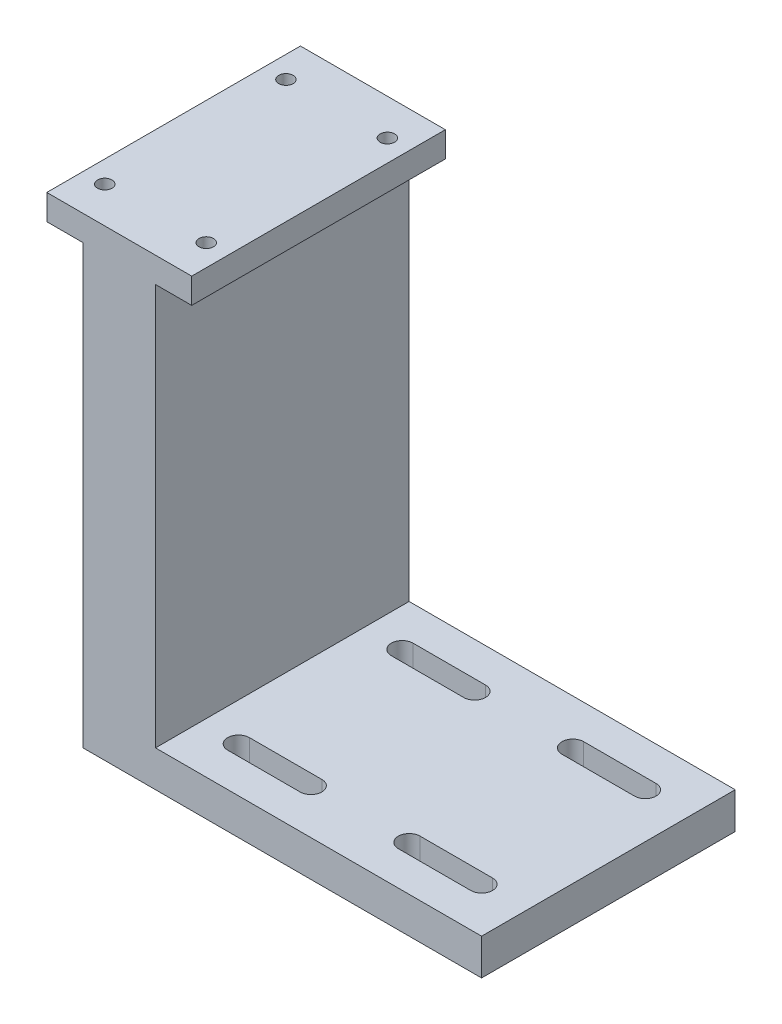
ISO-10303-21;
HEADER;
FILE_DESCRIPTION(('STEP AP214'),'2;1');
FILE_NAME('part.step','',(''),(''),'','','');
FILE_SCHEMA(('AUTOMOTIVE_DESIGN { 1 0 10303 214 1 1 1 1 }'));
ENDSEC;
DATA;
#1=APPLICATION_CONTEXT('core data for automotive mechanical design processes');
#2=APPLICATION_PROTOCOL_DEFINITION('international standard','automotive_design',2000,#1);
#3=PRODUCT_CONTEXT('',#1,'mechanical');
#4=PRODUCT('Part','Part','',(#3));
#5=PRODUCT_RELATED_PRODUCT_CATEGORY('part','',(#4));
#6=PRODUCT_DEFINITION_FORMATION('','',#4);
#7=PRODUCT_DEFINITION_CONTEXT('part definition',#1,'design');
#8=PRODUCT_DEFINITION('design','',#6,#7);
#9=PRODUCT_DEFINITION_SHAPE('','',#8);
#10=(LENGTH_UNIT() NAMED_UNIT(*) SI_UNIT(.MILLI.,.METRE.));
#11=(NAMED_UNIT(*) PLANE_ANGLE_UNIT() SI_UNIT($,.RADIAN.));
#12=(NAMED_UNIT(*) SI_UNIT($,.STERADIAN.) SOLID_ANGLE_UNIT());
#13=UNCERTAINTY_MEASURE_WITH_UNIT(LENGTH_MEASURE(1.E-05),#10,'distance_accuracy_value','');
#14=(GEOMETRIC_REPRESENTATION_CONTEXT(3) GLOBAL_UNCERTAINTY_ASSIGNED_CONTEXT((#13)) GLOBAL_UNIT_ASSIGNED_CONTEXT((#10,
#11,#12)) REPRESENTATION_CONTEXT('',''));
#15=CARTESIAN_POINT('',(0.,0.,0.));
#16=DIRECTION('',(0.,0.,1.));
#17=DIRECTION('',(1.,0.,0.));
#18=AXIS2_PLACEMENT_3D('',#15,#16,#17);
#19=CARTESIAN_POINT('',(-23.6589403421029,347.,-35.));
#20=DIRECTION('',(-1.,0.,0.));
#21=DIRECTION('',(0.,0.,1.));
#22=AXIS2_PLACEMENT_3D('',#19,#20,#21);
#23=PLANE('',#22);
#24=DIRECTION('',(0.,0.,-1.));
#25=VECTOR('',#24,1.);
#26=CARTESIAN_POINT('',(-23.6589403421029,120.762052520767,-35.));
#27=LINE('',#26,#25);
#28=CARTESIAN_POINT('',(-23.6589403421029,120.762052520767,35.));
#29=VERTEX_POINT('',#28);
#30=CARTESIAN_POINT('',(-23.6589403421029,120.762052520767,-35.));
#31=VERTEX_POINT('',#30);
#32=EDGE_CURVE('E314',#29,#31,#27,.T.);
#33=ORIENTED_EDGE('',*,*,#32,.F.);
#34=DIRECTION('',(0.,-1.,0.));
#35=VECTOR('',#34,1.);
#36=CARTESIAN_POINT('',(-23.6589403421029,347.,35.));
#37=LINE('',#36,#35);
#38=CARTESIAN_POINT('',(-23.6589403421029,10.,35.));
#39=VERTEX_POINT('',#38);
#40=EDGE_CURVE('E60',#29,#39,#37,.T.);
#41=ORIENTED_EDGE('',*,*,#40,.T.);
#42=DIRECTION('',(0.,0.,-1.));
#43=VECTOR('',#42,1.);
#44=CARTESIAN_POINT('',(-23.6589403421029,10.,0.));
#45=LINE('',#44,#43);
#46=CARTESIAN_POINT('',(-23.6589403421029,10.,-35.));
#47=VERTEX_POINT('',#46);
#48=EDGE_CURVE('E11',#39,#47,#45,.T.);
#49=ORIENTED_EDGE('',*,*,#48,.T.);
#50=DIRECTION('',(0.,-1.,0.));
#51=VECTOR('',#50,1.);
#52=CARTESIAN_POINT('',(-23.6589403421029,347.,-35.));
#53=LINE('',#52,#51);
#54=EDGE_CURVE('E291',#31,#47,#53,.T.);
#55=ORIENTED_EDGE('',*,*,#54,.F.);
#56=EDGE_LOOP('',(#33,#41,#49,#55));
#57=FACE_BOUND('',#56,.T.);
#58=ADVANCED_FACE('F43',(#57),#23,.F.);
#59=CARTESIAN_POINT('',(-43.6589403421029,347.,-35.));
#60=DIRECTION('',(1.,0.,0.));
#61=DIRECTION('',(0.,0.,-1.));
#62=AXIS2_PLACEMENT_3D('',#59,#60,#61);
#63=PLANE('',#62);
#64=DIRECTION('',(0.,0.,1.));
#65=VECTOR('',#64,1.);
#66=CARTESIAN_POINT('',(-43.6589403421029,120.762052520767,-35.));
#67=LINE('',#66,#65);
#68=CARTESIAN_POINT('',(-43.6589403421029,120.762052520767,-35.));
#69=VERTEX_POINT('',#68);
#70=CARTESIAN_POINT('',(-43.6589403421029,120.762052520767,35.));
#71=VERTEX_POINT('',#70);
#72=EDGE_CURVE('E320',#69,#71,#67,.T.);
#73=ORIENTED_EDGE('',*,*,#72,.F.);
#74=DIRECTION('',(0.,-1.,0.));
#75=VECTOR('',#74,1.);
#76=CARTESIAN_POINT('',(-43.6589403421029,347.,-35.));
#77=LINE('',#76,#75);
#78=CARTESIAN_POINT('',(-43.6589403421029,0.,-35.));
#79=VERTEX_POINT('',#78);
#80=EDGE_CURVE('E295',#69,#79,#77,.T.);
#81=ORIENTED_EDGE('',*,*,#80,.T.);
#82=DIRECTION('',(0.,0.,1.));
#83=VECTOR('',#82,1.);
#84=CARTESIAN_POINT('',(-43.6589403421029,0.,0.));
#85=LINE('',#84,#83);
#86=CARTESIAN_POINT('',(-43.6589403421029,0.,35.));
#87=VERTEX_POINT('',#86);
#88=EDGE_CURVE('E421',#79,#87,#85,.T.);
#89=ORIENTED_EDGE('',*,*,#88,.T.);
#90=DIRECTION('',(0.,-1.,0.));
#91=VECTOR('',#90,1.);
#92=CARTESIAN_POINT('',(-43.6589403421029,347.,35.));
#93=LINE('',#92,#91);
#94=EDGE_CURVE('E299',#71,#87,#93,.T.);
#95=ORIENTED_EDGE('',*,*,#94,.F.);
#96=EDGE_LOOP('',(#73,#81,#89,#95));
#97=FACE_BOUND('',#96,.T.);
#98=ADVANCED_FACE('F495',(#97),#63,.F.);
#99=CARTESIAN_POINT('',(0.,127.762052520767,0.));
#100=DIRECTION('',(0.,1.,0.));
#101=DIRECTION('',(0.,0.,1.));
#102=AXIS2_PLACEMENT_3D('',#99,#100,#101);
#103=PLANE('',#102);
#104=DIRECTION('',(1.,0.,0.));
#105=VECTOR('',#104,1.);
#106=CARTESIAN_POINT('',(-23.6589403421029,127.762052520767,35.));
#107=LINE('',#106,#105);
#108=CARTESIAN_POINT('',(-53.6589403421029,127.762052520767,35.));
#109=VERTEX_POINT('',#108);
#110=CARTESIAN_POINT('',(-13.6589403421029,127.762052520767,35.));
#111=VERTEX_POINT('',#110);
#112=EDGE_CURVE('E47',#109,#111,#107,.T.);
#113=ORIENTED_EDGE('',*,*,#112,.T.);
#114=DIRECTION('',(0.,0.,-1.));
#115=VECTOR('',#114,1.);
#116=CARTESIAN_POINT('',(-13.6589403421029,127.762052520767,-35.));
#117=LINE('',#116,#115);
#118=CARTESIAN_POINT('',(-13.6589403421029,127.762052520767,-35.));
#119=VERTEX_POINT('',#118);
#120=EDGE_CURVE('E525',#111,#119,#117,.T.);
#121=ORIENTED_EDGE('',*,*,#120,.T.);
#122=DIRECTION('',(-1.,0.,0.));
#123=VECTOR('',#122,1.);
#124=CARTESIAN_POINT('',(-23.6589403421029,127.762052520767,-35.));
#125=LINE('',#124,#123);
#126=CARTESIAN_POINT('',(-53.6589403421029,127.762052520767,-35.));
#127=VERTEX_POINT('',#126);
#128=EDGE_CURVE('E296',#119,#127,#125,.T.);
#129=ORIENTED_EDGE('',*,*,#128,.T.);
#130=DIRECTION('',(0.,0.,1.));
#131=VECTOR('',#130,1.);
#132=CARTESIAN_POINT('',(-53.6589403421029,127.762052520767,-35.));
#133=LINE('',#132,#131);
#134=EDGE_CURVE('E534',#127,#109,#133,.T.);
#135=ORIENTED_EDGE('',*,*,#134,.T.);
#136=EDGE_LOOP('',(#113,#121,#129,#135));
#137=FACE_BOUND('',#136,.T.);
#138=CARTESIAN_POINT('',(-47.6589403421029,127.762052520767,-25.));
#139=DIRECTION('',(0.,1.,0.));
#140=DIRECTION('',(0.,0.,1.));
#141=AXIS2_PLACEMENT_3D('',#138,#139,#140);
#142=CIRCLE('',#141,2.);
#143=CARTESIAN_POINT('',(-47.6589403421029,127.762052520767,-23.));
#144=VERTEX_POINT('',#143);
#145=EDGE_CURVE('E565',#144,#144,#142,.T.);
#146=ORIENTED_EDGE('',*,*,#145,.F.);
#147=EDGE_LOOP('',(#146));
#148=FACE_BOUND('',#147,.T.);
#149=CARTESIAN_POINT('',(-47.6589403421029,127.762052520767,25.));
#150=DIRECTION('',(0.,1.,0.));
#151=DIRECTION('',(0.,0.,-1.));
#152=AXIS2_PLACEMENT_3D('',#149,#150,#151);
#153=CIRCLE('',#152,2.);
#154=CARTESIAN_POINT('',(-47.6589403421029,127.762052520767,23.));
#155=VERTEX_POINT('',#154);
#156=EDGE_CURVE('E573',#155,#155,#153,.T.);
#157=ORIENTED_EDGE('',*,*,#156,.F.);
#158=EDGE_LOOP('',(#157));
#159=FACE_BOUND('',#158,.T.);
#160=CARTESIAN_POINT('',(-19.6589403421029,127.762052520767,25.));
#161=DIRECTION('',(0.,1.,0.));
#162=DIRECTION('',(0.,0.,1.));
#163=AXIS2_PLACEMENT_3D('',#160,#161,#162);
#164=CIRCLE('',#163,2.);
#165=CARTESIAN_POINT('',(-19.6589403421029,127.762052520767,27.));
#166=VERTEX_POINT('',#165);
#167=EDGE_CURVE('E581',#166,#166,#164,.T.);
#168=ORIENTED_EDGE('',*,*,#167,.F.);
#169=EDGE_LOOP('',(#168));
#170=FACE_BOUND('',#169,.T.);
#171=CARTESIAN_POINT('',(-19.6589403421029,127.762052520767,-25.));
#172=DIRECTION('',(0.,1.,0.));
#173=DIRECTION('',(0.,0.,-1.));
#174=AXIS2_PLACEMENT_3D('',#171,#172,#173);
#175=CIRCLE('',#174,2.);
#176=CARTESIAN_POINT('',(-19.6589403421029,127.762052520767,-27.));
#177=VERTEX_POINT('',#176);
#178=EDGE_CURVE('E589',#177,#177,#175,.T.);
#179=ORIENTED_EDGE('',*,*,#178,.F.);
#180=EDGE_LOOP('',(#179));
#181=FACE_BOUND('',#180,.T.);
#182=ADVANCED_FACE('F45',(#137,#148,#159,#170,#181),#103,.T.);
#183=CARTESIAN_POINT('',(-23.6589403421029,347.,-35.));
#184=DIRECTION('',(0.,0.,1.));
#185=DIRECTION('',(1.,0.,0.));
#186=AXIS2_PLACEMENT_3D('',#183,#184,#185);
#187=PLANE('',#186);
#188=ORIENTED_EDGE('',*,*,#128,.F.);
#189=DIRECTION('',(0.,1.,0.));
#190=VECTOR('',#189,1.);
#191=CARTESIAN_POINT('',(-13.6589403421029,120.762052520767,-35.));
#192=LINE('',#191,#190);
#193=CARTESIAN_POINT('',(-13.6589403421029,120.762052520767,-35.));
#194=VERTEX_POINT('',#193);
#195=EDGE_CURVE('E515',#194,#119,#192,.T.);
#196=ORIENTED_EDGE('',*,*,#195,.F.);
#197=DIRECTION('',(-1.,0.,0.));
#198=VECTOR('',#197,1.);
#199=CARTESIAN_POINT('',(-53.6589403421029,120.762052520767,-35.));
#200=LINE('',#199,#198);
#201=EDGE_CURVE('E551',#194,#31,#200,.T.);
#202=ORIENTED_EDGE('',*,*,#201,.T.);
#203=ORIENTED_EDGE('',*,*,#54,.T.);
#204=DIRECTION('',(1.,0.,0.));
#205=VECTOR('',#204,1.);
#206=CARTESIAN_POINT('',(0.,10.,-35.));
#207=LINE('',#206,#205);
#208=CARTESIAN_POINT('',(66.3410596578971,10.,-35.));
#209=VERTEX_POINT('',#208);
#210=EDGE_CURVE('E262',#47,#209,#207,.T.);
#211=ORIENTED_EDGE('',*,*,#210,.T.);
#212=DIRECTION('',(0.,-1.,0.));
#213=VECTOR('',#212,1.);
#214=CARTESIAN_POINT('',(66.3410596578971,10.,-35.));
#215=LINE('',#214,#213);
#216=CARTESIAN_POINT('',(66.3410596578971,0.,-35.));
#217=VERTEX_POINT('',#216);
#218=EDGE_CURVE('E344',#209,#217,#215,.T.);
#219=ORIENTED_EDGE('',*,*,#218,.T.);
#220=DIRECTION('',(1.,0.,0.));
#221=VECTOR('',#220,1.);
#222=CARTESIAN_POINT('',(0.,0.,-35.));
#223=LINE('',#222,#221);
#224=EDGE_CURVE('E425',#79,#217,#223,.T.);
#225=ORIENTED_EDGE('',*,*,#224,.F.);
#226=ORIENTED_EDGE('',*,*,#80,.F.);
#227=CARTESIAN_POINT('',(-53.6589403421029,120.762052520767,-35.));
#228=VERTEX_POINT('',#227);
#229=EDGE_CURVE('E555',#69,#228,#200,.T.);
#230=ORIENTED_EDGE('',*,*,#229,.T.);
#231=DIRECTION('',(0.,1.,0.));
#232=VECTOR('',#231,1.);
#233=CARTESIAN_POINT('',(-53.6589403421029,120.762052520767,-35.));
#234=LINE('',#233,#232);
#235=EDGE_CURVE('E329',#228,#127,#234,.T.);
#236=ORIENTED_EDGE('',*,*,#235,.T.);
#237=EDGE_LOOP('',(#188,#196,#202,#203,#211,#219,#225,#226,#230,#236));
#238=FACE_BOUND('',#237,.T.);
#239=ADVANCED_FACE('F494',(#238),#187,.F.);
#240=CARTESIAN_POINT('',(-23.6589403421029,347.,35.));
#241=DIRECTION('',(0.,0.,-1.));
#242=DIRECTION('',(-1.,0.,0.));
#243=AXIS2_PLACEMENT_3D('',#240,#241,#242);
#244=PLANE('',#243);
#245=ORIENTED_EDGE('',*,*,#112,.F.);
#246=DIRECTION('',(0.,1.,0.));
#247=VECTOR('',#246,1.);
#248=CARTESIAN_POINT('',(-53.6589403421029,120.762052520767,35.));
#249=LINE('',#248,#247);
#250=CARTESIAN_POINT('',(-53.6589403421029,120.762052520767,35.));
#251=VERTEX_POINT('',#250);
#252=EDGE_CURVE('E548',#251,#109,#249,.T.);
#253=ORIENTED_EDGE('',*,*,#252,.F.);
#254=DIRECTION('',(1.,0.,0.));
#255=VECTOR('',#254,1.);
#256=CARTESIAN_POINT('',(-53.6589403421029,120.762052520767,35.));
#257=LINE('',#256,#255);
#258=EDGE_CURVE('E561',#251,#71,#257,.T.);
#259=ORIENTED_EDGE('',*,*,#258,.T.);
#260=ORIENTED_EDGE('',*,*,#94,.T.);
#261=DIRECTION('',(1.,0.,0.));
#262=VECTOR('',#261,1.);
#263=CARTESIAN_POINT('',(0.,0.,35.));
#264=LINE('',#263,#262);
#265=CARTESIAN_POINT('',(66.3410596578971,0.,35.));
#266=VERTEX_POINT('',#265);
#267=EDGE_CURVE('E418',#87,#266,#264,.T.);
#268=ORIENTED_EDGE('',*,*,#267,.T.);
#269=DIRECTION('',(0.,-1.,0.));
#270=VECTOR('',#269,1.);
#271=CARTESIAN_POINT('',(66.3410596578971,10.,35.));
#272=LINE('',#271,#270);
#273=CARTESIAN_POINT('',(66.3410596578971,10.,35.));
#274=VERTEX_POINT('',#273);
#275=EDGE_CURVE('E352',#274,#266,#272,.T.);
#276=ORIENTED_EDGE('',*,*,#275,.F.);
#277=DIRECTION('',(1.,0.,0.));
#278=VECTOR('',#277,1.);
#279=CARTESIAN_POINT('',(0.,10.,35.));
#280=LINE('',#279,#278);
#281=EDGE_CURVE('E259',#39,#274,#280,.T.);
#282=ORIENTED_EDGE('',*,*,#281,.F.);
#283=ORIENTED_EDGE('',*,*,#40,.F.);
#284=CARTESIAN_POINT('',(-13.6589403421029,120.762052520767,35.));
#285=VERTEX_POINT('',#284);
#286=EDGE_CURVE('E539',#29,#285,#257,.T.);
#287=ORIENTED_EDGE('',*,*,#286,.T.);
#288=DIRECTION('',(0.,1.,0.));
#289=VECTOR('',#288,1.);
#290=CARTESIAN_POINT('',(-13.6589403421029,120.762052520767,35.));
#291=LINE('',#290,#289);
#292=EDGE_CURVE('E529',#285,#111,#291,.T.);
#293=ORIENTED_EDGE('',*,*,#292,.T.);
#294=EDGE_LOOP('',(#245,#253,#259,#260,#268,#276,#282,#283,#287,#293));
#295=FACE_BOUND('',#294,.T.);
#296=ADVANCED_FACE('F504',(#295),#244,.F.);
#297=CARTESIAN_POINT('',(0.,10.,19.5781705890519));
#298=DIRECTION('',(0.,0.,-1.));
#299=DIRECTION('',(-1.,0.,0.));
#300=AXIS2_PLACEMENT_3D('',#297,#298,#299);
#301=PLANE('',#300);
#302=DIRECTION('',(1.,0.,0.));
#303=VECTOR('',#302,1.);
#304=CARTESIAN_POINT('',(0.,0.,19.5781705890519));
#305=LINE('',#304,#303);
#306=CARTESIAN_POINT('',(-13.1581731814688,0.,19.5781705890519));
#307=VERTEX_POINT('',#306);
#308=CARTESIAN_POINT('',(6.84182681853121,0.,19.5781705890519));
#309=VERTEX_POINT('',#308);
#310=EDGE_CURVE('E395',#307,#309,#305,.T.);
#311=ORIENTED_EDGE('',*,*,#310,.T.);
#312=DIRECTION('',(0.,-1.,0.));
#313=VECTOR('',#312,1.);
#314=CARTESIAN_POINT('',(6.84182681853121,10.,19.5781705890519));
#315=LINE('',#314,#313);
#316=CARTESIAN_POINT('',(6.84182681853121,10.,19.5781705890519));
#317=VERTEX_POINT('',#316);
#318=EDGE_CURVE('E303',#317,#309,#315,.T.);
#319=ORIENTED_EDGE('',*,*,#318,.F.);
#320=DIRECTION('',(1.,0.,0.));
#321=VECTOR('',#320,1.);
#322=CARTESIAN_POINT('',(0.,10.,19.5781705890519));
#323=LINE('',#322,#321);
#324=CARTESIAN_POINT('',(-13.1581731814688,10.,19.5781705890519));
#325=VERTEX_POINT('',#324);
#326=EDGE_CURVE('E237',#325,#317,#323,.T.);
#327=ORIENTED_EDGE('',*,*,#326,.F.);
#328=DIRECTION('',(0.,-1.,0.));
#329=VECTOR('',#328,1.);
#330=CARTESIAN_POINT('',(-13.1581731814688,10.,19.5781705890519));
#331=LINE('',#330,#329);
#332=EDGE_CURVE('E365',#325,#307,#331,.T.);
#333=ORIENTED_EDGE('',*,*,#332,.T.);
#334=EDGE_LOOP('',(#311,#319,#327,#333));
#335=FACE_BOUND('',#334,.T.);
#336=ADVANCED_FACE('F475',(#335),#301,.F.);
#337=CARTESIAN_POINT('',(6.84182681853121,10.,22.5781705890519));
#338=DIRECTION('',(0.,-1.,0.));
#339=DIRECTION('',(0.,0.,-1.));
#340=AXIS2_PLACEMENT_3D('',#337,#338,#339);
#341=CYLINDRICAL_SURFACE('',#340,2.99999999999999);
#342=CARTESIAN_POINT('',(6.84182681853121,0.,22.5781705890519));
#343=DIRECTION('',(0.,1.,0.));
#344=DIRECTION('',(0.,0.,1.));
#345=AXIS2_PLACEMENT_3D('',#342,#343,#344);
#346=CIRCLE('',#345,2.99999999999999);
#347=CARTESIAN_POINT('',(6.84182681853121,0.,25.5781705890519));
#348=VERTEX_POINT('',#347);
#349=EDGE_CURVE('E391',#309,#348,#346,.F.);
#350=ORIENTED_EDGE('',*,*,#349,.T.);
#351=DIRECTION('',(0.,-1.,0.));
#352=VECTOR('',#351,1.);
#353=CARTESIAN_POINT('',(6.84182681853121,10.,25.5781705890519));
#354=LINE('',#353,#352);
#355=CARTESIAN_POINT('',(6.84182681853121,10.,25.5781705890519));
#356=VERTEX_POINT('',#355);
#357=EDGE_CURVE('E377',#356,#348,#354,.T.);
#358=ORIENTED_EDGE('',*,*,#357,.F.);
#359=CARTESIAN_POINT('',(6.84182681853121,10.,22.5781705890519));
#360=DIRECTION('',(0.,1.,0.));
#361=DIRECTION('',(0.,0.,1.));
#362=AXIS2_PLACEMENT_3D('',#359,#360,#361);
#363=CIRCLE('',#362,2.99999999999999);
#364=EDGE_CURVE('E234',#317,#356,#363,.F.);
#365=ORIENTED_EDGE('',*,*,#364,.F.);
#366=ORIENTED_EDGE('',*,*,#318,.T.);
#367=EDGE_LOOP('',(#350,#358,#365,#366));
#368=FACE_BOUND('',#367,.T.);
#369=ADVANCED_FACE('F478',(#368),#341,.F.);
#370=CARTESIAN_POINT('',(0.,10.,25.5781705890519));
#371=DIRECTION('',(0.,0.,-1.));
#372=DIRECTION('',(-1.,0.,0.));
#373=AXIS2_PLACEMENT_3D('',#370,#371,#372);
#374=PLANE('',#373);
#375=DIRECTION('',(1.,0.,0.));
#376=VECTOR('',#375,1.);
#377=CARTESIAN_POINT('',(0.,0.,25.5781705890519));
#378=LINE('',#377,#376);
#379=CARTESIAN_POINT('',(-13.1581731814688,0.,25.5781705890519));
#380=VERTEX_POINT('',#379);
#381=EDGE_CURVE('E387',#380,#348,#378,.T.);
#382=ORIENTED_EDGE('',*,*,#381,.F.);
#383=DIRECTION('',(0.,-1.,0.));
#384=VECTOR('',#383,1.);
#385=CARTESIAN_POINT('',(-13.1581731814688,10.,25.5781705890519));
#386=LINE('',#385,#384);
#387=CARTESIAN_POINT('',(-13.1581731814688,10.,25.5781705890519));
#388=VERTEX_POINT('',#387);
#389=EDGE_CURVE('E380',#388,#380,#386,.T.);
#390=ORIENTED_EDGE('',*,*,#389,.F.);
#391=DIRECTION('',(1.,0.,0.));
#392=VECTOR('',#391,1.);
#393=CARTESIAN_POINT('',(0.,10.,25.5781705890519));
#394=LINE('',#393,#392);
#395=EDGE_CURVE('E230',#388,#356,#394,.T.);
#396=ORIENTED_EDGE('',*,*,#395,.T.);
#397=ORIENTED_EDGE('',*,*,#357,.T.);
#398=EDGE_LOOP('',(#382,#390,#396,#397));
#399=FACE_BOUND('',#398,.T.);
#400=ADVANCED_FACE('F481',(#399),#374,.T.);
#401=CARTESIAN_POINT('',(0.,10.,-19.5781705890519));
#402=DIRECTION('',(0.,0.,1.));
#403=DIRECTION('',(1.,0.,0.));
#404=AXIS2_PLACEMENT_3D('',#401,#402,#403);
#405=PLANE('',#404);
#406=DIRECTION('',(-1.,0.,0.));
#407=VECTOR('',#406,1.);
#408=CARTESIAN_POINT('',(0.,0.,-19.5781705890519));
#409=LINE('',#408,#407);
#410=CARTESIAN_POINT('',(53.9400520408786,0.,-19.5781705890519));
#411=VERTEX_POINT('',#410);
#412=CARTESIAN_POINT('',(33.9400520408786,0.,-19.5781705890519));
#413=VERTEX_POINT('',#412);
#414=EDGE_CURVE('E410',#411,#413,#409,.T.);
#415=ORIENTED_EDGE('',*,*,#414,.T.);
#416=DIRECTION('',(0.,-1.,0.));
#417=VECTOR('',#416,1.);
#418=CARTESIAN_POINT('',(33.9400520408786,10.,-19.5781705890519));
#419=LINE('',#418,#417);
#420=CARTESIAN_POINT('',(33.9400520408786,10.,-19.5781705890519));
#421=VERTEX_POINT('',#420);
#422=EDGE_CURVE('E360',#421,#413,#419,.T.);
#423=ORIENTED_EDGE('',*,*,#422,.F.);
#424=DIRECTION('',(-1.,0.,0.));
#425=VECTOR('',#424,1.);
#426=CARTESIAN_POINT('',(0.,10.,-19.5781705890519));
#427=LINE('',#426,#425);
#428=CARTESIAN_POINT('',(53.9400520408786,10.,-19.5781705890519));
#429=VERTEX_POINT('',#428);
#430=EDGE_CURVE('E251',#429,#421,#427,.T.);
#431=ORIENTED_EDGE('',*,*,#430,.F.);
#432=DIRECTION('',(0.,-1.,0.));
#433=VECTOR('',#432,1.);
#434=CARTESIAN_POINT('',(53.9400520408786,10.,-19.5781705890519));
#435=LINE('',#434,#433);
#436=EDGE_CURVE('E356',#429,#411,#435,.T.);
#437=ORIENTED_EDGE('',*,*,#436,.T.);
#438=EDGE_LOOP('',(#415,#423,#431,#437));
#439=FACE_BOUND('',#438,.T.);
#440=ADVANCED_FACE('F649',(#439),#405,.F.);
#441=CARTESIAN_POINT('',(33.9400520408786,10.,-22.5781705890519));
#442=DIRECTION('',(0.,-1.,0.));
#443=DIRECTION('',(0.,0.,-1.));
#444=AXIS2_PLACEMENT_3D('',#441,#442,#443);
#445=CYLINDRICAL_SURFACE('',#444,2.99999999999999);
#446=CARTESIAN_POINT('',(33.9400520408786,0.,-22.5781705890519));
#447=DIRECTION('',(0.,1.,0.));
#448=DIRECTION('',(0.,0.,1.));
#449=AXIS2_PLACEMENT_3D('',#446,#447,#448);
#450=CIRCLE('',#449,2.99999999999999);
#451=CARTESIAN_POINT('',(33.9400520408786,0.,-25.5781705890519));
#452=VERTEX_POINT('',#451);
#453=EDGE_CURVE('E406',#413,#452,#450,.F.);
#454=ORIENTED_EDGE('',*,*,#453,.T.);
#455=DIRECTION('',(0.,-1.,0.));
#456=VECTOR('',#455,1.);
#457=CARTESIAN_POINT('',(33.9400520408786,10.,-25.5781705890519));
#458=LINE('',#457,#456);
#459=CARTESIAN_POINT('',(33.9400520408786,10.,-25.5781705890519));
#460=VERTEX_POINT('',#459);
#461=EDGE_CURVE('E364',#460,#452,#458,.T.);
#462=ORIENTED_EDGE('',*,*,#461,.F.);
#463=CARTESIAN_POINT('',(33.9400520408786,10.,-22.5781705890519));
#464=DIRECTION('',(0.,1.,0.));
#465=DIRECTION('',(0.,0.,1.));
#466=AXIS2_PLACEMENT_3D('',#463,#464,#465);
#467=CIRCLE('',#466,2.99999999999999);
#468=EDGE_CURVE('E248',#421,#460,#467,.F.);
#469=ORIENTED_EDGE('',*,*,#468,.F.);
#470=ORIENTED_EDGE('',*,*,#422,.T.);
#471=EDGE_LOOP('',(#454,#462,#469,#470));
#472=FACE_BOUND('',#471,.T.);
#473=ADVANCED_FACE('F652',(#472),#445,.F.);
#474=CARTESIAN_POINT('',(0.,10.,-25.5781705890519));
#475=DIRECTION('',(0.,0.,1.));
#476=DIRECTION('',(1.,0.,0.));
#477=AXIS2_PLACEMENT_3D('',#474,#475,#476);
#478=PLANE('',#477);
#479=DIRECTION('',(-1.,0.,0.));
#480=VECTOR('',#479,1.);
#481=CARTESIAN_POINT('',(0.,0.,-25.5781705890519));
#482=LINE('',#481,#480);
#483=CARTESIAN_POINT('',(53.9400520408786,0.,-25.5781705890519));
#484=VERTEX_POINT('',#483);
#485=EDGE_CURVE('E402',#484,#452,#482,.T.);
#486=ORIENTED_EDGE('',*,*,#485,.F.);
#487=DIRECTION('',(0.,-1.,0.));
#488=VECTOR('',#487,1.);
#489=CARTESIAN_POINT('',(53.9400520408786,10.,-25.5781705890519));
#490=LINE('',#489,#488);
#491=CARTESIAN_POINT('',(53.9400520408786,10.,-25.5781705890519));
#492=VERTEX_POINT('',#491);
#493=EDGE_CURVE('E368',#492,#484,#490,.T.);
#494=ORIENTED_EDGE('',*,*,#493,.F.);
#495=DIRECTION('',(-1.,0.,0.));
#496=VECTOR('',#495,1.);
#497=CARTESIAN_POINT('',(0.,10.,-25.5781705890519));
#498=LINE('',#497,#496);
#499=EDGE_CURVE('E244',#492,#460,#498,.T.);
#500=ORIENTED_EDGE('',*,*,#499,.T.);
#501=ORIENTED_EDGE('',*,*,#461,.T.);
#502=EDGE_LOOP('',(#486,#494,#500,#501));
#503=FACE_BOUND('',#502,.T.);
#504=ADVANCED_FACE('F638',(#503),#478,.T.);
#505=CARTESIAN_POINT('',(33.9400520408786,10.,22.5781705890519));
#506=DIRECTION('',(0.,-1.,0.));
#507=DIRECTION('',(0.,0.,-1.));
#508=AXIS2_PLACEMENT_3D('',#505,#506,#507);
#509=CYLINDRICAL_SURFACE('',#508,2.99999999999999);
#510=CARTESIAN_POINT('',(33.9400520408786,0.,22.5781705890519));
#511=DIRECTION('',(0.,1.,0.));
#512=DIRECTION('',(0.,0.,1.));
#513=AXIS2_PLACEMENT_3D('',#510,#511,#512);
#514=CIRCLE('',#513,2.99999999999999);
#515=CARTESIAN_POINT('',(33.9400520408786,0.,19.5781705890519));
#516=VERTEX_POINT('',#515);
#517=CARTESIAN_POINT('',(33.9400520408786,0.,25.5781705890519));
#518=VERTEX_POINT('',#517);
#519=EDGE_CURVE('E215',#516,#518,#514,.T.);
#520=ORIENTED_EDGE('',*,*,#519,.F.);
#521=DIRECTION('',(0.,-1.,0.));
#522=VECTOR('',#521,1.);
#523=CARTESIAN_POINT('',(33.9400520408786,10.,19.5781705890519));
#524=LINE('',#523,#522);
#525=CARTESIAN_POINT('',(33.9400520408786,10.,19.5781705890519));
#526=VERTEX_POINT('',#525);
#527=EDGE_CURVE('E340',#526,#516,#524,.T.);
#528=ORIENTED_EDGE('',*,*,#527,.F.);
#529=CARTESIAN_POINT('',(33.9400520408786,10.,22.5781705890519));
#530=DIRECTION('',(0.,1.,0.));
#531=DIRECTION('',(0.,0.,1.));
#532=AXIS2_PLACEMENT_3D('',#529,#530,#531);
#533=CIRCLE('',#532,2.99999999999999);
#534=CARTESIAN_POINT('',(33.9400520408786,10.,25.5781705890519));
#535=VERTEX_POINT('',#534);
#536=EDGE_CURVE('E276',#526,#535,#533,.T.);
#537=ORIENTED_EDGE('',*,*,#536,.T.);
#538=DIRECTION('',(0.,-1.,0.));
#539=VECTOR('',#538,1.);
#540=CARTESIAN_POINT('',(33.9400520408786,10.,25.5781705890519));
#541=LINE('',#540,#539);
#542=EDGE_CURVE('E335',#535,#518,#541,.T.);
#543=ORIENTED_EDGE('',*,*,#542,.T.);
#544=EDGE_LOOP('',(#520,#528,#537,#543));
#545=FACE_BOUND('',#544,.T.);
#546=ADVANCED_FACE('F447',(#545),#509,.F.);
#547=CARTESIAN_POINT('',(0.,10.,19.5781705890519));
#548=DIRECTION('',(0.,0.,1.));
#549=DIRECTION('',(1.,0.,0.));
#550=AXIS2_PLACEMENT_3D('',#547,#548,#549);
#551=PLANE('',#550);
#552=DIRECTION('',(-1.,0.,0.));
#553=VECTOR('',#552,1.);
#554=CARTESIAN_POINT('',(0.,0.,19.5781705890519));
#555=LINE('',#554,#553);
#556=CARTESIAN_POINT('',(53.9400520408786,0.,19.5781705890519));
#557=VERTEX_POINT('',#556);
#558=EDGE_CURVE('E436',#557,#516,#555,.T.);
#559=ORIENTED_EDGE('',*,*,#558,.F.);
#560=DIRECTION('',(0.,-1.,0.));
#561=VECTOR('',#560,1.);
#562=CARTESIAN_POINT('',(53.9400520408786,10.,19.5781705890519));
#563=LINE('',#562,#561);
#564=CARTESIAN_POINT('',(53.9400520408786,10.,19.5781705890519));
#565=VERTEX_POINT('',#564);
#566=EDGE_CURVE('E343',#565,#557,#563,.T.);
#567=ORIENTED_EDGE('',*,*,#566,.F.);
#568=DIRECTION('',(-1.,0.,0.));
#569=VECTOR('',#568,1.);
#570=CARTESIAN_POINT('',(0.,10.,19.5781705890519));
#571=LINE('',#570,#569);
#572=EDGE_CURVE('E272',#565,#526,#571,.T.);
#573=ORIENTED_EDGE('',*,*,#572,.T.);
#574=ORIENTED_EDGE('',*,*,#527,.T.);
#575=EDGE_LOOP('',(#559,#567,#573,#574));
#576=FACE_BOUND('',#575,.T.);
#577=ADVANCED_FACE('F458',(#576),#551,.T.);
#578=CARTESIAN_POINT('',(53.9400520408786,10.,22.5781705890519));
#579=DIRECTION('',(0.,-1.,0.));
#580=DIRECTION('',(0.,0.,-1.));
#581=AXIS2_PLACEMENT_3D('',#578,#579,#580);
#582=CYLINDRICAL_SURFACE('',#581,2.99999999999999);
#583=CARTESIAN_POINT('',(53.9400520408786,0.,22.5781705890519));
#584=DIRECTION('',(0.,1.,0.));
#585=DIRECTION('',(0.,0.,1.));
#586=AXIS2_PLACEMENT_3D('',#583,#584,#585);
#587=CIRCLE('',#586,2.99999999999999);
#588=CARTESIAN_POINT('',(53.9400520408786,0.,25.5781705890519));
#589=VERTEX_POINT('',#588);
#590=EDGE_CURVE('E432',#589,#557,#587,.T.);
#591=ORIENTED_EDGE('',*,*,#590,.F.);
#592=DIRECTION('',(0.,-1.,0.));
#593=VECTOR('',#592,1.);
#594=CARTESIAN_POINT('',(53.9400520408786,10.,25.5781705890519));
#595=LINE('',#594,#593);
#596=CARTESIAN_POINT('',(53.9400520408786,10.,25.5781705890519));
#597=VERTEX_POINT('',#596);
#598=EDGE_CURVE('E347',#597,#589,#595,.T.);
#599=ORIENTED_EDGE('',*,*,#598,.F.);
#600=CARTESIAN_POINT('',(53.9400520408786,10.,22.5781705890519));
#601=DIRECTION('',(0.,1.,0.));
#602=DIRECTION('',(0.,0.,1.));
#603=AXIS2_PLACEMENT_3D('',#600,#601,#602);
#604=CIRCLE('',#603,2.99999999999999);
#605=EDGE_CURVE('E268',#597,#565,#604,.T.);
#606=ORIENTED_EDGE('',*,*,#605,.T.);
#607=ORIENTED_EDGE('',*,*,#566,.T.);
#608=EDGE_LOOP('',(#591,#599,#606,#607));
#609=FACE_BOUND('',#608,.T.);
#610=ADVANCED_FACE('F455',(#609),#582,.F.);
#611=CARTESIAN_POINT('',(6.84182681853121,10.,-22.5781705890519));
#612=DIRECTION('',(0.,-1.,0.));
#613=DIRECTION('',(0.,0.,-1.));
#614=AXIS2_PLACEMENT_3D('',#611,#612,#613);
#615=CYLINDRICAL_SURFACE('',#614,2.99999999999999);
#616=CARTESIAN_POINT('',(6.84182681853121,0.,-22.5781705890519));
#617=DIRECTION('',(0.,1.,0.));
#618=DIRECTION('',(0.,0.,1.));
#619=AXIS2_PLACEMENT_3D('',#616,#617,#618);
#620=CIRCLE('',#619,2.99999999999999);
#621=CARTESIAN_POINT('',(6.84182681853121,0.,-19.5781705890519));
#622=VERTEX_POINT('',#621);
#623=CARTESIAN_POINT('',(6.84182681853121,0.,-25.5781705890519));
#624=VERTEX_POINT('',#623);
#625=EDGE_CURVE('E53',#622,#624,#620,.T.);
#626=ORIENTED_EDGE('',*,*,#625,.F.);
#627=DIRECTION('',(0.,-1.,0.));
#628=VECTOR('',#627,1.);
#629=CARTESIAN_POINT('',(6.84182681853121,10.,-19.5781705890519));
#630=LINE('',#629,#628);
#631=CARTESIAN_POINT('',(6.84182681853121,10.,-19.5781705890519));
#632=VERTEX_POINT('',#631);
#633=EDGE_CURVE('E69',#632,#622,#630,.T.);
#634=ORIENTED_EDGE('',*,*,#633,.F.);
#635=CARTESIAN_POINT('',(6.84182681853121,10.,-22.5781705890519));
#636=DIRECTION('',(0.,1.,0.));
#637=DIRECTION('',(0.,0.,1.));
#638=AXIS2_PLACEMENT_3D('',#635,#636,#637);
#639=CIRCLE('',#638,2.99999999999999);
#640=CARTESIAN_POINT('',(6.84182681853121,10.,-25.5781705890519));
#641=VERTEX_POINT('',#640);
#642=EDGE_CURVE('E288',#632,#641,#639,.T.);
#643=ORIENTED_EDGE('',*,*,#642,.T.);
#644=DIRECTION('',(0.,-1.,0.));
#645=VECTOR('',#644,1.);
#646=CARTESIAN_POINT('',(6.84182681853121,10.,-25.5781705890519));
#647=LINE('',#646,#645);
#648=EDGE_CURVE('E205',#641,#624,#647,.T.);
#649=ORIENTED_EDGE('',*,*,#648,.T.);
#650=EDGE_LOOP('',(#626,#634,#643,#649));
#651=FACE_BOUND('',#650,.T.);
#652=ADVANCED_FACE('F625',(#651),#615,.F.);
#653=CARTESIAN_POINT('',(0.,10.,-19.5781705890519));
#654=DIRECTION('',(0.,0.,-1.));
#655=DIRECTION('',(-1.,0.,0.));
#656=AXIS2_PLACEMENT_3D('',#653,#654,#655);
#657=PLANE('',#656);
#658=DIRECTION('',(1.,0.,0.));
#659=VECTOR('',#658,1.);
#660=CARTESIAN_POINT('',(0.,0.,-19.5781705890519));
#661=LINE('',#660,#659);
#662=CARTESIAN_POINT('',(-13.1581731814688,0.,-19.5781705890519));
#663=VERTEX_POINT('',#662);
#664=EDGE_CURVE('E219',#663,#622,#661,.T.);
#665=ORIENTED_EDGE('',*,*,#664,.F.);
#666=DIRECTION('',(0.,-1.,0.));
#667=VECTOR('',#666,1.);
#668=CARTESIAN_POINT('',(-13.1581731814688,10.,-19.5781705890519));
#669=LINE('',#668,#667);
#670=CARTESIAN_POINT('',(-13.1581731814688,10.,-19.5781705890519));
#671=VERTEX_POINT('',#670);
#672=EDGE_CURVE('E206',#671,#663,#669,.T.);
#673=ORIENTED_EDGE('',*,*,#672,.F.);
#674=DIRECTION('',(1.,0.,0.));
#675=VECTOR('',#674,1.);
#676=CARTESIAN_POINT('',(0.,10.,-19.5781705890519));
#677=LINE('',#676,#675);
#678=EDGE_CURVE('E285',#671,#632,#677,.T.);
#679=ORIENTED_EDGE('',*,*,#678,.T.);
#680=ORIENTED_EDGE('',*,*,#633,.T.);
#681=EDGE_LOOP('',(#665,#673,#679,#680));
#682=FACE_BOUND('',#681,.T.);
#683=ADVANCED_FACE('F628',(#682),#657,.T.);
#684=CARTESIAN_POINT('',(-13.1581731814688,10.,-22.5781705890519));
#685=DIRECTION('',(0.,-1.,0.));
#686=DIRECTION('',(0.,0.,-1.));
#687=AXIS2_PLACEMENT_3D('',#684,#685,#686);
#688=CYLINDRICAL_SURFACE('',#687,2.99999999999999);
#689=CARTESIAN_POINT('',(-13.1581731814688,0.,-22.5781705890519));
#690=DIRECTION('',(0.,1.,0.));
#691=DIRECTION('',(0.,0.,1.));
#692=AXIS2_PLACEMENT_3D('',#689,#690,#691);
#693=CIRCLE('',#692,2.99999999999999);
#694=CARTESIAN_POINT('',(-13.1581731814688,0.,-25.5781705890519));
#695=VERTEX_POINT('',#694);
#696=EDGE_CURVE('E213',#695,#663,#693,.T.);
#697=ORIENTED_EDGE('',*,*,#696,.F.);
#698=DIRECTION('',(0.,-1.,0.));
#699=VECTOR('',#698,1.);
#700=CARTESIAN_POINT('',(-13.1581731814688,10.,-25.5781705890519));
#701=LINE('',#700,#699);
#702=CARTESIAN_POINT('',(-13.1581731814688,10.,-25.5781705890519));
#703=VERTEX_POINT('',#702);
#704=EDGE_CURVE('E193',#703,#695,#701,.T.);
#705=ORIENTED_EDGE('',*,*,#704,.F.);
#706=CARTESIAN_POINT('',(-13.1581731814688,10.,-22.5781705890519));
#707=DIRECTION('',(0.,1.,0.));
#708=DIRECTION('',(0.,0.,1.));
#709=AXIS2_PLACEMENT_3D('',#706,#707,#708);
#710=CIRCLE('',#709,2.99999999999999);
#711=EDGE_CURVE('E282',#703,#671,#710,.T.);
#712=ORIENTED_EDGE('',*,*,#711,.T.);
#713=ORIENTED_EDGE('',*,*,#672,.T.);
#714=EDGE_LOOP('',(#697,#705,#712,#713));
#715=FACE_BOUND('',#714,.T.);
#716=ADVANCED_FACE('F217',(#715),#688,.F.);
#717=CARTESIAN_POINT('',(53.9400520408786,10.,-22.5781705890519));
#718=DIRECTION('',(0.,-1.,0.));
#719=DIRECTION('',(0.,0.,-1.));
#720=AXIS2_PLACEMENT_3D('',#717,#718,#719);
#721=CYLINDRICAL_SURFACE('',#720,2.99999999999999);
#722=CARTESIAN_POINT('',(53.9400520408786,0.,-22.5781705890519));
#723=DIRECTION('',(0.,1.,0.));
#724=DIRECTION('',(0.,0.,1.));
#725=AXIS2_PLACEMENT_3D('',#722,#723,#724);
#726=CIRCLE('',#725,2.99999999999999);
#727=EDGE_CURVE('E399',#484,#411,#726,.F.);
#728=ORIENTED_EDGE('',*,*,#727,.T.);
#729=ORIENTED_EDGE('',*,*,#436,.F.);
#730=CARTESIAN_POINT('',(53.9400520408786,10.,-22.5781705890519));
#731=DIRECTION('',(0.,1.,0.));
#732=DIRECTION('',(0.,0.,1.));
#733=AXIS2_PLACEMENT_3D('',#730,#731,#732);
#734=CIRCLE('',#733,2.99999999999999);
#735=EDGE_CURVE('E241',#492,#429,#734,.F.);
#736=ORIENTED_EDGE('',*,*,#735,.F.);
#737=ORIENTED_EDGE('',*,*,#493,.T.);
#738=EDGE_LOOP('',(#728,#729,#736,#737));
#739=FACE_BOUND('',#738,.T.);
#740=ADVANCED_FACE('F633',(#739),#721,.F.);
#741=CARTESIAN_POINT('',(66.3410596578971,10.,0.));
#742=DIRECTION('',(1.,0.,0.));
#743=DIRECTION('',(0.,0.,-1.));
#744=AXIS2_PLACEMENT_3D('',#741,#742,#743);
#745=PLANE('',#744);
#746=DIRECTION('',(0.,0.,1.));
#747=VECTOR('',#746,1.);
#748=CARTESIAN_POINT('',(66.3410596578971,0.,0.));
#749=LINE('',#748,#747);
#750=EDGE_CURVE('E414',#217,#266,#749,.T.);
#751=ORIENTED_EDGE('',*,*,#750,.F.);
#752=ORIENTED_EDGE('',*,*,#218,.F.);
#753=DIRECTION('',(0.,0.,1.));
#754=VECTOR('',#753,1.);
#755=CARTESIAN_POINT('',(66.3410596578971,10.,0.));
#756=LINE('',#755,#754);
#757=EDGE_CURVE('E255',#209,#274,#756,.T.);
#758=ORIENTED_EDGE('',*,*,#757,.T.);
#759=ORIENTED_EDGE('',*,*,#275,.T.);
#760=EDGE_LOOP('',(#751,#752,#758,#759));
#761=FACE_BOUND('',#760,.T.);
#762=ADVANCED_FACE('F645',(#761),#745,.T.);
#763=CARTESIAN_POINT('',(0.,10.,25.5781705890519));
#764=DIRECTION('',(0.,0.,1.));
#765=DIRECTION('',(1.,0.,0.));
#766=AXIS2_PLACEMENT_3D('',#763,#764,#765);
#767=PLANE('',#766);
#768=DIRECTION('',(-1.,0.,0.));
#769=VECTOR('',#768,1.);
#770=CARTESIAN_POINT('',(0.,0.,25.5781705890519));
#771=LINE('',#770,#769);
#772=EDGE_CURVE('E428',#589,#518,#771,.T.);
#773=ORIENTED_EDGE('',*,*,#772,.T.);
#774=ORIENTED_EDGE('',*,*,#542,.F.);
#775=DIRECTION('',(-1.,0.,0.));
#776=VECTOR('',#775,1.);
#777=CARTESIAN_POINT('',(0.,10.,25.5781705890519));
#778=LINE('',#777,#776);
#779=EDGE_CURVE('E265',#597,#535,#778,.T.);
#780=ORIENTED_EDGE('',*,*,#779,.F.);
#781=ORIENTED_EDGE('',*,*,#598,.T.);
#782=EDGE_LOOP('',(#773,#774,#780,#781));
#783=FACE_BOUND('',#782,.T.);
#784=ADVANCED_FACE('F452',(#783),#767,.F.);
#785=CARTESIAN_POINT('',(0.,10.,-25.5781705890519));
#786=DIRECTION('',(0.,0.,-1.));
#787=DIRECTION('',(-1.,0.,0.));
#788=AXIS2_PLACEMENT_3D('',#785,#786,#787);
#789=PLANE('',#788);
#790=DIRECTION('',(1.,0.,0.));
#791=VECTOR('',#790,1.);
#792=CARTESIAN_POINT('',(0.,0.,-25.5781705890519));
#793=LINE('',#792,#791);
#794=EDGE_CURVE('E197',#695,#624,#793,.T.);
#795=ORIENTED_EDGE('',*,*,#794,.T.);
#796=ORIENTED_EDGE('',*,*,#648,.F.);
#797=DIRECTION('',(1.,0.,0.));
#798=VECTOR('',#797,1.);
#799=CARTESIAN_POINT('',(0.,10.,-25.5781705890519));
#800=LINE('',#799,#798);
#801=EDGE_CURVE('E199',#703,#641,#800,.T.);
#802=ORIENTED_EDGE('',*,*,#801,.F.);
#803=ORIENTED_EDGE('',*,*,#704,.T.);
#804=EDGE_LOOP('',(#795,#796,#802,#803));
#805=FACE_BOUND('',#804,.T.);
#806=ADVANCED_FACE('F195',(#805),#789,.F.);
#807=CARTESIAN_POINT('',(-13.1581731814688,10.,22.5781705890519));
#808=DIRECTION('',(0.,-1.,0.));
#809=DIRECTION('',(0.,0.,-1.));
#810=AXIS2_PLACEMENT_3D('',#807,#808,#809);
#811=CYLINDRICAL_SURFACE('',#810,2.99999999999999);
#812=CARTESIAN_POINT('',(-13.1581731814688,0.,22.5781705890519));
#813=DIRECTION('',(0.,1.,0.));
#814=DIRECTION('',(0.,0.,1.));
#815=AXIS2_PLACEMENT_3D('',#812,#813,#814);
#816=CIRCLE('',#815,2.99999999999999);
#817=EDGE_CURVE('E139',#380,#307,#816,.F.);
#818=ORIENTED_EDGE('',*,*,#817,.T.);
#819=ORIENTED_EDGE('',*,*,#332,.F.);
#820=CARTESIAN_POINT('',(-13.1581731814688,10.,22.5781705890519));
#821=DIRECTION('',(0.,1.,0.));
#822=DIRECTION('',(0.,0.,1.));
#823=AXIS2_PLACEMENT_3D('',#820,#821,#822);
#824=CIRCLE('',#823,2.99999999999999);
#825=EDGE_CURVE('E227',#388,#325,#824,.F.);
#826=ORIENTED_EDGE('',*,*,#825,.F.);
#827=ORIENTED_EDGE('',*,*,#389,.T.);
#828=EDGE_LOOP('',(#818,#819,#826,#827));
#829=FACE_BOUND('',#828,.T.);
#830=ADVANCED_FACE('F463',(#829),#811,.F.);
#831=CARTESIAN_POINT('',(0.,10.,0.));
#832=DIRECTION('',(0.,1.,0.));
#833=DIRECTION('',(0.,0.,1.));
#834=AXIS2_PLACEMENT_3D('',#831,#832,#833);
#835=PLANE('',#834);
#836=ORIENTED_EDGE('',*,*,#48,.F.);
#837=ORIENTED_EDGE('',*,*,#281,.T.);
#838=ORIENTED_EDGE('',*,*,#757,.F.);
#839=ORIENTED_EDGE('',*,*,#210,.F.);
#840=EDGE_LOOP('',(#836,#837,#838,#839));
#841=FACE_BOUND('',#840,.T.);
#842=ORIENTED_EDGE('',*,*,#642,.F.);
#843=ORIENTED_EDGE('',*,*,#678,.F.);
#844=ORIENTED_EDGE('',*,*,#711,.F.);
#845=ORIENTED_EDGE('',*,*,#801,.T.);
#846=EDGE_LOOP('',(#842,#843,#844,#845));
#847=FACE_BOUND('',#846,.T.);
#848=ORIENTED_EDGE('',*,*,#536,.F.);
#849=ORIENTED_EDGE('',*,*,#572,.F.);
#850=ORIENTED_EDGE('',*,*,#605,.F.);
#851=ORIENTED_EDGE('',*,*,#779,.T.);
#852=EDGE_LOOP('',(#848,#849,#850,#851));
#853=FACE_BOUND('',#852,.T.);
#854=ORIENTED_EDGE('',*,*,#430,.T.);
#855=ORIENTED_EDGE('',*,*,#468,.T.);
#856=ORIENTED_EDGE('',*,*,#499,.F.);
#857=ORIENTED_EDGE('',*,*,#735,.T.);
#858=EDGE_LOOP('',(#854,#855,#856,#857));
#859=FACE_BOUND('',#858,.T.);
#860=ORIENTED_EDGE('',*,*,#326,.T.);
#861=ORIENTED_EDGE('',*,*,#364,.T.);
#862=ORIENTED_EDGE('',*,*,#395,.F.);
#863=ORIENTED_EDGE('',*,*,#825,.T.);
#864=EDGE_LOOP('',(#860,#861,#862,#863));
#865=FACE_BOUND('',#864,.T.);
#866=ADVANCED_FACE('F460',(#841,#847,#853,#859,#865),#835,.T.);
#867=CARTESIAN_POINT('',(0.,0.,0.));
#868=DIRECTION('',(0.,1.,0.));
#869=DIRECTION('',(0.,0.,1.));
#870=AXIS2_PLACEMENT_3D('',#867,#868,#869);
#871=PLANE('',#870);
#872=ORIENTED_EDGE('',*,*,#625,.T.);
#873=ORIENTED_EDGE('',*,*,#794,.F.);
#874=ORIENTED_EDGE('',*,*,#696,.T.);
#875=ORIENTED_EDGE('',*,*,#664,.T.);
#876=EDGE_LOOP('',(#872,#873,#874,#875));
#877=FACE_BOUND('',#876,.T.);
#878=ORIENTED_EDGE('',*,*,#519,.T.);
#879=ORIENTED_EDGE('',*,*,#772,.F.);
#880=ORIENTED_EDGE('',*,*,#590,.T.);
#881=ORIENTED_EDGE('',*,*,#558,.T.);
#882=EDGE_LOOP('',(#878,#879,#880,#881));
#883=FACE_BOUND('',#882,.T.);
#884=ORIENTED_EDGE('',*,*,#750,.T.);
#885=ORIENTED_EDGE('',*,*,#267,.F.);
#886=ORIENTED_EDGE('',*,*,#88,.F.);
#887=ORIENTED_EDGE('',*,*,#224,.T.);
#888=EDGE_LOOP('',(#884,#885,#886,#887));
#889=FACE_BOUND('',#888,.T.);
#890=ORIENTED_EDGE('',*,*,#414,.F.);
#891=ORIENTED_EDGE('',*,*,#727,.F.);
#892=ORIENTED_EDGE('',*,*,#485,.T.);
#893=ORIENTED_EDGE('',*,*,#453,.F.);
#894=EDGE_LOOP('',(#890,#891,#892,#893));
#895=FACE_BOUND('',#894,.T.);
#896=ORIENTED_EDGE('',*,*,#310,.F.);
#897=ORIENTED_EDGE('',*,*,#817,.F.);
#898=ORIENTED_EDGE('',*,*,#381,.T.);
#899=ORIENTED_EDGE('',*,*,#349,.F.);
#900=EDGE_LOOP('',(#896,#897,#898,#899));
#901=FACE_BOUND('',#900,.T.);
#902=ADVANCED_FACE('F210',(#877,#883,#889,#895,#901),#871,.F.);
#903=CARTESIAN_POINT('',(-53.6589403421029,120.762052520767,-35.));
#904=DIRECTION('',(-1.,0.,0.));
#905=DIRECTION('',(0.,0.,1.));
#906=AXIS2_PLACEMENT_3D('',#903,#904,#905);
#907=PLANE('',#906);
#908=ORIENTED_EDGE('',*,*,#134,.F.);
#909=ORIENTED_EDGE('',*,*,#235,.F.);
#910=DIRECTION('',(0.,0.,1.));
#911=VECTOR('',#910,1.);
#912=CARTESIAN_POINT('',(-53.6589403421029,120.762052520767,-35.));
#913=LINE('',#912,#911);
#914=EDGE_CURVE('E533',#228,#251,#913,.T.);
#915=ORIENTED_EDGE('',*,*,#914,.T.);
#916=ORIENTED_EDGE('',*,*,#252,.T.);
#917=EDGE_LOOP('',(#908,#909,#915,#916));
#918=FACE_BOUND('',#917,.T.);
#919=ADVANCED_FACE('F484',(#918),#907,.T.);
#920=CARTESIAN_POINT('',(-47.6589403421029,120.762052520767,25.));
#921=DIRECTION('',(0.,1.,0.));
#922=DIRECTION('',(0.,0.,1.));
#923=AXIS2_PLACEMENT_3D('',#920,#921,#922);
#924=CYLINDRICAL_SURFACE('',#923,2.);
#925=CARTESIAN_POINT('',(-47.6589403421029,120.762052520767,25.));
#926=DIRECTION('',(0.,1.,0.));
#927=DIRECTION('',(0.,0.,-1.));
#928=AXIS2_PLACEMENT_3D('',#925,#926,#927);
#929=CIRCLE('',#928,2.);
#930=CARTESIAN_POINT('',(-47.6589403421029,120.762052520767,23.));
#931=VERTEX_POINT('',#930);
#932=EDGE_CURVE('E569',#931,#931,#929,.T.);
#933=ORIENTED_EDGE('',*,*,#932,.F.);
#934=EDGE_LOOP('',(#933));
#935=FACE_BOUND('',#934,.T.);
#936=ORIENTED_EDGE('',*,*,#156,.T.);
#937=EDGE_LOOP('',(#936));
#938=FACE_BOUND('',#937,.T.);
#939=ADVANCED_FACE('F489',(#935,#938),#924,.F.);
#940=CARTESIAN_POINT('',(-47.6589403421029,120.762052520767,-25.));
#941=DIRECTION('',(0.,1.,0.));
#942=DIRECTION('',(0.,0.,1.));
#943=AXIS2_PLACEMENT_3D('',#940,#941,#942);
#944=CYLINDRICAL_SURFACE('',#943,2.);
#945=CARTESIAN_POINT('',(-47.6589403421029,120.762052520767,-25.));
#946=DIRECTION('',(0.,1.,0.));
#947=DIRECTION('',(0.,0.,1.));
#948=AXIS2_PLACEMENT_3D('',#945,#946,#947);
#949=CIRCLE('',#948,2.);
#950=CARTESIAN_POINT('',(-47.6589403421029,120.762052520767,-23.));
#951=VERTEX_POINT('',#950);
#952=EDGE_CURVE('E541',#951,#951,#949,.T.);
#953=ORIENTED_EDGE('',*,*,#952,.F.);
#954=EDGE_LOOP('',(#953));
#955=FACE_BOUND('',#954,.T.);
#956=ORIENTED_EDGE('',*,*,#145,.T.);
#957=EDGE_LOOP('',(#956));
#958=FACE_BOUND('',#957,.T.);
#959=ADVANCED_FACE('F615',(#955,#958),#944,.F.);
#960=CARTESIAN_POINT('',(0.,120.762052520767,0.));
#961=DIRECTION('',(0.,1.,0.));
#962=DIRECTION('',(0.,0.,1.));
#963=AXIS2_PLACEMENT_3D('',#960,#961,#962);
#964=PLANE('',#963);
#965=ORIENTED_EDGE('',*,*,#952,.T.);
#966=EDGE_LOOP('',(#965));
#967=FACE_BOUND('',#966,.T.);
#968=ORIENTED_EDGE('',*,*,#932,.T.);
#969=EDGE_LOOP('',(#968));
#970=FACE_BOUND('',#969,.T.);
#971=ORIENTED_EDGE('',*,*,#229,.F.);
#972=ORIENTED_EDGE('',*,*,#72,.T.);
#973=ORIENTED_EDGE('',*,*,#258,.F.);
#974=ORIENTED_EDGE('',*,*,#914,.F.);
#975=EDGE_LOOP('',(#971,#972,#973,#974));
#976=FACE_BOUND('',#975,.T.);
#977=ADVANCED_FACE('F619',(#967,#970,#976),#964,.F.);
#978=CARTESIAN_POINT('',(-19.6589403421029,120.762052520767,-25.));
#979=DIRECTION('',(0.,1.,0.));
#980=DIRECTION('',(0.,0.,-1.));
#981=AXIS2_PLACEMENT_3D('',#978,#979,#980);
#982=CIRCLE('',#981,2.);
#983=CARTESIAN_POINT('',(-19.6589403421029,120.762052520767,-27.));
#984=VERTEX_POINT('',#983);
#985=EDGE_CURVE('E585',#984,#984,#982,.T.);
#986=ORIENTED_EDGE('',*,*,#985,.T.);
#987=EDGE_LOOP('',(#986));
#988=FACE_BOUND('',#987,.T.);
#989=CARTESIAN_POINT('',(-19.6589403421029,120.762052520767,25.));
#990=DIRECTION('',(0.,1.,0.));
#991=DIRECTION('',(0.,0.,1.));
#992=AXIS2_PLACEMENT_3D('',#989,#990,#991);
#993=CIRCLE('',#992,2.);
#994=CARTESIAN_POINT('',(-19.6589403421029,120.762052520767,27.));
#995=VERTEX_POINT('',#994);
#996=EDGE_CURVE('E577',#995,#995,#993,.T.);
#997=ORIENTED_EDGE('',*,*,#996,.T.);
#998=EDGE_LOOP('',(#997));
#999=FACE_BOUND('',#998,.T.);
#1000=ORIENTED_EDGE('',*,*,#286,.F.);
#1001=ORIENTED_EDGE('',*,*,#32,.T.);
#1002=ORIENTED_EDGE('',*,*,#201,.F.);
#1003=DIRECTION('',(0.,0.,-1.));
#1004=VECTOR('',#1003,1.);
#1005=CARTESIAN_POINT('',(-13.6589403421029,120.762052520767,-35.));
#1006=LINE('',#1005,#1004);
#1007=EDGE_CURVE('E527',#285,#194,#1006,.T.);
#1008=ORIENTED_EDGE('',*,*,#1007,.F.);
#1009=EDGE_LOOP('',(#1000,#1001,#1002,#1008));
#1010=FACE_BOUND('',#1009,.T.);
#1011=ADVANCED_FACE('F597',(#988,#999,#1010),#964,.F.);
#1012=CARTESIAN_POINT('',(-13.6589403421029,120.762052520767,-35.));
#1013=DIRECTION('',(1.,0.,0.));
#1014=DIRECTION('',(0.,0.,-1.));
#1015=AXIS2_PLACEMENT_3D('',#1012,#1013,#1014);
#1016=PLANE('',#1015);
#1017=ORIENTED_EDGE('',*,*,#120,.F.);
#1018=ORIENTED_EDGE('',*,*,#292,.F.);
#1019=ORIENTED_EDGE('',*,*,#1007,.T.);
#1020=ORIENTED_EDGE('',*,*,#195,.T.);
#1021=EDGE_LOOP('',(#1017,#1018,#1019,#1020));
#1022=FACE_BOUND('',#1021,.T.);
#1023=ADVANCED_FACE('F523',(#1022),#1016,.T.);
#1024=CARTESIAN_POINT('',(-19.6589403421029,120.762052520767,25.));
#1025=DIRECTION('',(0.,1.,0.));
#1026=DIRECTION('',(0.,0.,1.));
#1027=AXIS2_PLACEMENT_3D('',#1024,#1025,#1026);
#1028=CYLINDRICAL_SURFACE('',#1027,2.);
#1029=ORIENTED_EDGE('',*,*,#996,.F.);
#1030=EDGE_LOOP('',(#1029));
#1031=FACE_BOUND('',#1030,.T.);
#1032=ORIENTED_EDGE('',*,*,#167,.T.);
#1033=EDGE_LOOP('',(#1032));
#1034=FACE_BOUND('',#1033,.T.);
#1035=ADVANCED_FACE('F603',(#1031,#1034),#1028,.F.);
#1036=CARTESIAN_POINT('',(-19.6589403421029,120.762052520767,-25.));
#1037=DIRECTION('',(0.,1.,0.));
#1038=DIRECTION('',(0.,0.,1.));
#1039=AXIS2_PLACEMENT_3D('',#1036,#1037,#1038);
#1040=CYLINDRICAL_SURFACE('',#1039,2.);
#1041=ORIENTED_EDGE('',*,*,#985,.F.);
#1042=EDGE_LOOP('',(#1041));
#1043=FACE_BOUND('',#1042,.T.);
#1044=ORIENTED_EDGE('',*,*,#178,.T.);
#1045=EDGE_LOOP('',(#1044));
#1046=FACE_BOUND('',#1045,.T.);
#1047=ADVANCED_FACE('F600',(#1043,#1046),#1040,.F.);
#1048=CLOSED_SHELL('',(#58,#98,#182,#239,#296,#336,#369,#400,#440,#473,#504,#546,#577,#610,#652,
#683,#716,#740,#762,#784,#806,#830,#866,#902,#919,#939,#959,#977,#1011,#1023,#1035,#1047));
#1049=MANIFOLD_SOLID_BREP('B2',#1048);
#1050=ADVANCED_BREP_SHAPE_REPRESENTATION('',(#18,#1049),#14);
#1051=SHAPE_DEFINITION_REPRESENTATION(#9,#1050);
ENDSEC;
END-ISO-10303-21;
